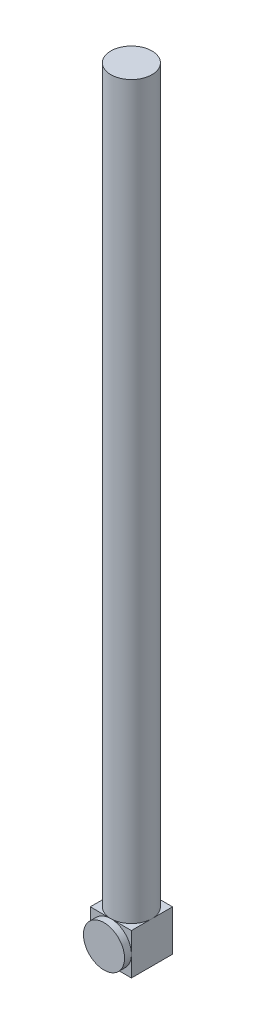
ISO-10303-21;
HEADER;
FILE_DESCRIPTION(('STEP AP214'),'2;1');
FILE_NAME('part.step','',(''),(''),'','','');
FILE_SCHEMA(('AUTOMOTIVE_DESIGN { 1 0 10303 214 1 1 1 1 }'));
ENDSEC;
DATA;
#1=APPLICATION_CONTEXT('core data for automotive mechanical design processes');
#2=APPLICATION_PROTOCOL_DEFINITION('international standard','automotive_design',2000,#1);
#3=PRODUCT_CONTEXT('',#1,'mechanical');
#4=PRODUCT('Part','Part','',(#3));
#5=PRODUCT_RELATED_PRODUCT_CATEGORY('part','',(#4));
#6=PRODUCT_DEFINITION_FORMATION('','',#4);
#7=PRODUCT_DEFINITION_CONTEXT('part definition',#1,'design');
#8=PRODUCT_DEFINITION('design','',#6,#7);
#9=PRODUCT_DEFINITION_SHAPE('','',#8);
#10=(LENGTH_UNIT() NAMED_UNIT(*) SI_UNIT(.MILLI.,.METRE.));
#11=(NAMED_UNIT(*) PLANE_ANGLE_UNIT() SI_UNIT($,.RADIAN.));
#12=(NAMED_UNIT(*) SI_UNIT($,.STERADIAN.) SOLID_ANGLE_UNIT());
#13=UNCERTAINTY_MEASURE_WITH_UNIT(LENGTH_MEASURE(1.E-05),#10,'distance_accuracy_value','');
#14=(GEOMETRIC_REPRESENTATION_CONTEXT(3) GLOBAL_UNCERTAINTY_ASSIGNED_CONTEXT((#13)) GLOBAL_UNIT_ASSIGNED_CONTEXT((#10,
#11,#12)) REPRESENTATION_CONTEXT('',''));
#15=CARTESIAN_POINT('',(0.,0.,0.));
#16=DIRECTION('',(0.,0.,1.));
#17=DIRECTION('',(1.,0.,0.));
#18=AXIS2_PLACEMENT_3D('',#15,#16,#17);
#19=CARTESIAN_POINT('',(0.,-15.,7.5));
#20=DIRECTION('',(0.,0.,1.));
#21=DIRECTION('',(1.,0.,0.));
#22=AXIS2_PLACEMENT_3D('',#19,#20,#21);
#23=PLANE('',#22);
#24=DIRECTION('',(0.,1.,0.));
#25=VECTOR('',#24,1.);
#26=CARTESIAN_POINT('',(7.5,-15.,7.5));
#27=LINE('',#26,#25);
#28=CARTESIAN_POINT('',(7.5,-15.,7.5));
#29=VERTEX_POINT('',#28);
#30=CARTESIAN_POINT('',(7.5,-7.5,7.5));
#31=VERTEX_POINT('',#30);
#32=EDGE_CURVE('E144',#29,#31,#27,.T.);
#33=ORIENTED_EDGE('',*,*,#32,.T.);
#34=CARTESIAN_POINT('',(0.,-7.5,7.5));
#35=DIRECTION('',(0.,0.,1.));
#36=DIRECTION('',(1.,0.,0.));
#37=AXIS2_PLACEMENT_3D('',#34,#35,#36);
#38=CIRCLE('',#37,7.5);
#39=CARTESIAN_POINT('',(0.,-15.,7.5));
#40=VERTEX_POINT('',#39);
#41=EDGE_CURVE('E48',#40,#31,#38,.T.);
#42=ORIENTED_EDGE('',*,*,#41,.F.);
#43=DIRECTION('',(1.,0.,0.));
#44=VECTOR('',#43,1.);
#45=CARTESIAN_POINT('',(0.,-15.,7.5));
#46=LINE('',#45,#44);
#47=EDGE_CURVE('E148',#40,#29,#46,.T.);
#48=ORIENTED_EDGE('',*,*,#47,.T.);
#49=EDGE_LOOP('',(#33,#42,#48));
#50=FACE_BOUND('',#49,.T.);
#51=ADVANCED_FACE('F33',(#50),#23,.T.);
#52=CARTESIAN_POINT('',(-7.5,-15.,7.5));
#53=VERTEX_POINT('',#52);
#54=EDGE_CURVE('E162',#53,#40,#46,.T.);
#55=ORIENTED_EDGE('',*,*,#54,.T.);
#56=CARTESIAN_POINT('',(-7.5,-7.5,7.5));
#57=VERTEX_POINT('',#56);
#58=EDGE_CURVE('E111',#57,#40,#38,.T.);
#59=ORIENTED_EDGE('',*,*,#58,.F.);
#60=DIRECTION('',(0.,1.,0.));
#61=VECTOR('',#60,1.);
#62=CARTESIAN_POINT('',(-7.5,-15.,7.5));
#63=LINE('',#62,#61);
#64=EDGE_CURVE('E133',#53,#57,#63,.T.);
#65=ORIENTED_EDGE('',*,*,#64,.F.);
#66=EDGE_LOOP('',(#55,#59,#65));
#67=FACE_BOUND('',#66,.T.);
#68=ADVANCED_FACE('F182',(#67),#23,.T.);
#69=CARTESIAN_POINT('',(-7.5,0.,7.5));
#70=VERTEX_POINT('',#69);
#71=EDGE_CURVE('E109',#57,#70,#63,.T.);
#72=ORIENTED_EDGE('',*,*,#71,.F.);
#73=CARTESIAN_POINT('',(0.,0.,7.5));
#74=VERTEX_POINT('',#73);
#75=EDGE_CURVE('E97',#74,#57,#38,.T.);
#76=ORIENTED_EDGE('',*,*,#75,.F.);
#77=DIRECTION('',(1.,0.,0.));
#78=VECTOR('',#77,1.);
#79=CARTESIAN_POINT('',(0.,0.,7.5));
#80=LINE('',#79,#78);
#81=EDGE_CURVE('E108',#70,#74,#80,.T.);
#82=ORIENTED_EDGE('',*,*,#81,.F.);
#83=EDGE_LOOP('',(#72,#76,#82));
#84=FACE_BOUND('',#83,.T.);
#85=ADVANCED_FACE('F107',(#84),#23,.T.);
#86=CARTESIAN_POINT('',(7.5,0.,7.5));
#87=VERTEX_POINT('',#86);
#88=EDGE_CURVE('E116',#74,#87,#80,.T.);
#89=ORIENTED_EDGE('',*,*,#88,.F.);
#90=EDGE_CURVE('E94',#31,#74,#38,.T.);
#91=ORIENTED_EDGE('',*,*,#90,.F.);
#92=EDGE_CURVE('E121',#31,#87,#27,.T.);
#93=ORIENTED_EDGE('',*,*,#92,.T.);
#94=EDGE_LOOP('',(#89,#91,#93));
#95=FACE_BOUND('',#94,.T.);
#96=ADVANCED_FACE('F120',(#95),#23,.T.);
#97=CARTESIAN_POINT('',(0.,266.7,0.));
#98=DIRECTION('',(0.,-1.,0.));
#99=DIRECTION('',(0.,0.,-1.));
#100=AXIS2_PLACEMENT_3D('',#97,#98,#99);
#101=CYLINDRICAL_SURFACE('',#100,7.5);
#102=CARTESIAN_POINT('',(0.,266.7,0.));
#103=DIRECTION('',(0.,1.,0.));
#104=DIRECTION('',(0.,0.,1.));
#105=AXIS2_PLACEMENT_3D('',#102,#103,#104);
#106=CIRCLE('',#105,7.5);
#107=CARTESIAN_POINT('',(0.,266.7,7.5));
#108=VERTEX_POINT('',#107);
#109=EDGE_CURVE('E11',#108,#108,#106,.T.);
#110=ORIENTED_EDGE('',*,*,#109,.F.);
#111=EDGE_LOOP('',(#110));
#112=FACE_BOUND('',#111,.T.);
#113=CARTESIAN_POINT('',(0.,0.,0.));
#114=DIRECTION('',(0.,1.,0.));
#115=DIRECTION('',(0.,0.,1.));
#116=AXIS2_PLACEMENT_3D('',#113,#114,#115);
#117=CIRCLE('',#116,7.5);
#118=CARTESIAN_POINT('',(7.5,0.,0.));
#119=VERTEX_POINT('',#118);
#120=EDGE_CURVE('E37',#74,#119,#117,.T.);
#121=ORIENTED_EDGE('',*,*,#120,.T.);
#122=CARTESIAN_POINT('',(0.,0.,-7.5));
#123=VERTEX_POINT('',#122);
#124=EDGE_CURVE('E130',#119,#123,#117,.T.);
#125=ORIENTED_EDGE('',*,*,#124,.T.);
#126=CARTESIAN_POINT('',(-7.5,0.,0.));
#127=VERTEX_POINT('',#126);
#128=EDGE_CURVE('E132',#123,#127,#117,.T.);
#129=ORIENTED_EDGE('',*,*,#128,.T.);
#130=EDGE_CURVE('E56',#127,#74,#117,.T.);
#131=ORIENTED_EDGE('',*,*,#130,.T.);
#132=EDGE_LOOP('',(#121,#125,#129,#131));
#133=FACE_BOUND('',#132,.T.);
#134=ADVANCED_FACE('F35',(#112,#133),#101,.T.);
#135=CARTESIAN_POINT('',(0.,266.7,0.));
#136=DIRECTION('',(0.,1.,0.));
#137=DIRECTION('',(0.,0.,1.));
#138=AXIS2_PLACEMENT_3D('',#135,#136,#137);
#139=PLANE('',#138);
#140=ORIENTED_EDGE('',*,*,#109,.T.);
#141=EDGE_LOOP('',(#140));
#142=FACE_BOUND('',#141,.T.);
#143=ADVANCED_FACE('F195',(#142),#139,.T.);
#144=CARTESIAN_POINT('',(0.,0.,-16.6414213562373));
#145=DIRECTION('',(0.,-1.,0.));
#146=DIRECTION('',(0.,0.,-1.));
#147=AXIS2_PLACEMENT_3D('',#144,#145,#146);
#148=PLANE('',#147);
#149=ORIENTED_EDGE('',*,*,#120,.F.);
#150=ORIENTED_EDGE('',*,*,#88,.T.);
#151=DIRECTION('',(0.,0.,-1.));
#152=VECTOR('',#151,1.);
#153=CARTESIAN_POINT('',(7.5,0.,-16.6414213562373));
#154=LINE('',#153,#152);
#155=EDGE_CURVE('E127',#87,#119,#154,.T.);
#156=ORIENTED_EDGE('',*,*,#155,.T.);
#157=EDGE_LOOP('',(#149,#150,#156));
#158=FACE_BOUND('',#157,.T.);
#159=ADVANCED_FACE('F126',(#158),#148,.F.);
#160=ORIENTED_EDGE('',*,*,#124,.F.);
#161=CARTESIAN_POINT('',(7.5,0.,-7.5));
#162=VERTEX_POINT('',#161);
#163=EDGE_CURVE('E149',#119,#162,#154,.T.);
#164=ORIENTED_EDGE('',*,*,#163,.T.);
#165=DIRECTION('',(1.,0.,0.));
#166=VECTOR('',#165,1.);
#167=CARTESIAN_POINT('',(0.,0.,-7.5));
#168=LINE('',#167,#166);
#169=EDGE_CURVE('E153',#123,#162,#168,.T.);
#170=ORIENTED_EDGE('',*,*,#169,.F.);
#171=EDGE_LOOP('',(#160,#164,#170));
#172=FACE_BOUND('',#171,.T.);
#173=ADVANCED_FACE('F233',(#172),#148,.F.);
#174=ORIENTED_EDGE('',*,*,#128,.F.);
#175=CARTESIAN_POINT('',(-7.5,0.,-7.5));
#176=VERTEX_POINT('',#175);
#177=EDGE_CURVE('E150',#176,#123,#168,.T.);
#178=ORIENTED_EDGE('',*,*,#177,.F.);
#179=DIRECTION('',(0.,0.,-1.));
#180=VECTOR('',#179,1.);
#181=CARTESIAN_POINT('',(-7.5,0.,-16.6414213562373));
#182=LINE('',#181,#180);
#183=EDGE_CURVE('E115',#127,#176,#182,.T.);
#184=ORIENTED_EDGE('',*,*,#183,.F.);
#185=EDGE_LOOP('',(#174,#178,#184));
#186=FACE_BOUND('',#185,.T.);
#187=ADVANCED_FACE('F179',(#186),#148,.F.);
#188=CARTESIAN_POINT('',(-7.5,-15.,-16.6414213562373));
#189=DIRECTION('',(1.,0.,0.));
#190=DIRECTION('',(0.,0.,-1.));
#191=AXIS2_PLACEMENT_3D('',#188,#189,#190);
#192=PLANE('',#191);
#193=EDGE_CURVE('E114',#70,#127,#182,.T.);
#194=ORIENTED_EDGE('',*,*,#193,.T.);
#195=ORIENTED_EDGE('',*,*,#183,.T.);
#196=DIRECTION('',(0.,1.,0.));
#197=VECTOR('',#196,1.);
#198=CARTESIAN_POINT('',(-7.5,-15.,-7.5));
#199=LINE('',#198,#197);
#200=CARTESIAN_POINT('',(-7.5,-15.,-7.5));
#201=VERTEX_POINT('',#200);
#202=EDGE_CURVE('E137',#201,#176,#199,.T.);
#203=ORIENTED_EDGE('',*,*,#202,.F.);
#204=DIRECTION('',(0.,0.,-1.));
#205=VECTOR('',#204,1.);
#206=CARTESIAN_POINT('',(-7.5,-15.,-16.6414213562373));
#207=LINE('',#206,#205);
#208=EDGE_CURVE('E160',#53,#201,#207,.T.);
#209=ORIENTED_EDGE('',*,*,#208,.F.);
#210=ORIENTED_EDGE('',*,*,#64,.T.);
#211=ORIENTED_EDGE('',*,*,#71,.T.);
#212=EDGE_LOOP('',(#194,#195,#203,#209,#210,#211));
#213=FACE_BOUND('',#212,.T.);
#214=ADVANCED_FACE('F219',(#213),#192,.F.);
#215=CARTESIAN_POINT('',(0.,-15.,-7.5));
#216=DIRECTION('',(0.,0.,1.));
#217=DIRECTION('',(1.,0.,0.));
#218=AXIS2_PLACEMENT_3D('',#215,#216,#217);
#219=PLANE('',#218);
#220=ORIENTED_EDGE('',*,*,#177,.T.);
#221=ORIENTED_EDGE('',*,*,#169,.T.);
#222=DIRECTION('',(0.,1.,0.));
#223=VECTOR('',#222,1.);
#224=CARTESIAN_POINT('',(7.5,-15.,-7.5));
#225=LINE('',#224,#223);
#226=CARTESIAN_POINT('',(7.5,-15.,-7.5));
#227=VERTEX_POINT('',#226);
#228=EDGE_CURVE('E141',#227,#162,#225,.T.);
#229=ORIENTED_EDGE('',*,*,#228,.F.);
#230=DIRECTION('',(1.,0.,0.));
#231=VECTOR('',#230,1.);
#232=CARTESIAN_POINT('',(0.,-15.,-7.5));
#233=LINE('',#232,#231);
#234=EDGE_CURVE('E158',#201,#227,#233,.T.);
#235=ORIENTED_EDGE('',*,*,#234,.F.);
#236=ORIENTED_EDGE('',*,*,#202,.T.);
#237=EDGE_LOOP('',(#220,#221,#229,#235,#236));
#238=FACE_BOUND('',#237,.T.);
#239=ADVANCED_FACE('F213',(#238),#219,.F.);
#240=CARTESIAN_POINT('',(7.5,-15.,-16.6414213562373));
#241=DIRECTION('',(1.,0.,0.));
#242=DIRECTION('',(0.,0.,-1.));
#243=AXIS2_PLACEMENT_3D('',#240,#241,#242);
#244=PLANE('',#243);
#245=ORIENTED_EDGE('',*,*,#155,.F.);
#246=ORIENTED_EDGE('',*,*,#92,.F.);
#247=ORIENTED_EDGE('',*,*,#32,.F.);
#248=DIRECTION('',(0.,0.,-1.));
#249=VECTOR('',#248,1.);
#250=CARTESIAN_POINT('',(7.5,-15.,-16.6414213562373));
#251=LINE('',#250,#249);
#252=EDGE_CURVE('E155',#29,#227,#251,.T.);
#253=ORIENTED_EDGE('',*,*,#252,.T.);
#254=ORIENTED_EDGE('',*,*,#228,.T.);
#255=ORIENTED_EDGE('',*,*,#163,.F.);
#256=EDGE_LOOP('',(#245,#246,#247,#253,#254,#255));
#257=FACE_BOUND('',#256,.T.);
#258=ADVANCED_FACE('F218',(#257),#244,.T.);
#259=CARTESIAN_POINT('',(0.,-15.,-16.6414213562373));
#260=DIRECTION('',(0.,-1.,0.));
#261=DIRECTION('',(0.,0.,-1.));
#262=AXIS2_PLACEMENT_3D('',#259,#260,#261);
#263=PLANE('',#262);
#264=ORIENTED_EDGE('',*,*,#54,.F.);
#265=ORIENTED_EDGE('',*,*,#208,.T.);
#266=ORIENTED_EDGE('',*,*,#234,.T.);
#267=ORIENTED_EDGE('',*,*,#252,.F.);
#268=ORIENTED_EDGE('',*,*,#47,.F.);
#269=EDGE_LOOP('',(#264,#265,#266,#267,#268));
#270=FACE_BOUND('',#269,.T.);
#271=ADVANCED_FACE('F177',(#270),#263,.T.);
#272=ORIENTED_EDGE('',*,*,#130,.F.);
#273=ORIENTED_EDGE('',*,*,#193,.F.);
#274=ORIENTED_EDGE('',*,*,#81,.T.);
#275=EDGE_LOOP('',(#272,#273,#274));
#276=FACE_BOUND('',#275,.T.);
#277=ADVANCED_FACE('F112',(#276),#148,.F.);
#278=CARTESIAN_POINT('',(0.,-7.5,10.));
#279=DIRECTION('',(0.,0.,-1.));
#280=DIRECTION('',(-1.,0.,0.));
#281=AXIS2_PLACEMENT_3D('',#278,#279,#280);
#282=CYLINDRICAL_SURFACE('',#281,7.5);
#283=CARTESIAN_POINT('',(0.,-7.5,10.));
#284=DIRECTION('',(0.,0.,1.));
#285=DIRECTION('',(1.,0.,0.));
#286=AXIS2_PLACEMENT_3D('',#283,#284,#285);
#287=CIRCLE('',#286,7.5);
#288=CARTESIAN_POINT('',(7.5,-7.5,10.));
#289=VERTEX_POINT('',#288);
#290=EDGE_CURVE('E102',#289,#289,#287,.T.);
#291=ORIENTED_EDGE('',*,*,#290,.F.);
#292=EDGE_LOOP('',(#291));
#293=FACE_BOUND('',#292,.T.);
#294=ORIENTED_EDGE('',*,*,#90,.T.);
#295=ORIENTED_EDGE('',*,*,#75,.T.);
#296=ORIENTED_EDGE('',*,*,#58,.T.);
#297=ORIENTED_EDGE('',*,*,#41,.T.);
#298=EDGE_LOOP('',(#294,#295,#296,#297));
#299=FACE_BOUND('',#298,.T.);
#300=ADVANCED_FACE('F96',(#293,#299),#282,.T.);
#301=CARTESIAN_POINT('',(0.,-7.5,10.));
#302=DIRECTION('',(0.,0.,1.));
#303=DIRECTION('',(1.,0.,0.));
#304=AXIS2_PLACEMENT_3D('',#301,#302,#303);
#305=PLANE('',#304);
#306=ORIENTED_EDGE('',*,*,#290,.T.);
#307=EDGE_LOOP('',(#306));
#308=FACE_BOUND('',#307,.T.);
#309=ADVANCED_FACE('F168',(#308),#305,.T.);
#310=CLOSED_SHELL('',(#51,#68,#85,#96,#134,#143,#159,#173,#187,#214,#239,#258,#271,#277,#300,#309));
#311=MANIFOLD_SOLID_BREP('B2',#310);
#312=ADVANCED_BREP_SHAPE_REPRESENTATION('',(#18,#311),#14);
#313=SHAPE_DEFINITION_REPRESENTATION(#9,#312);
ENDSEC;
END-ISO-10303-21;
